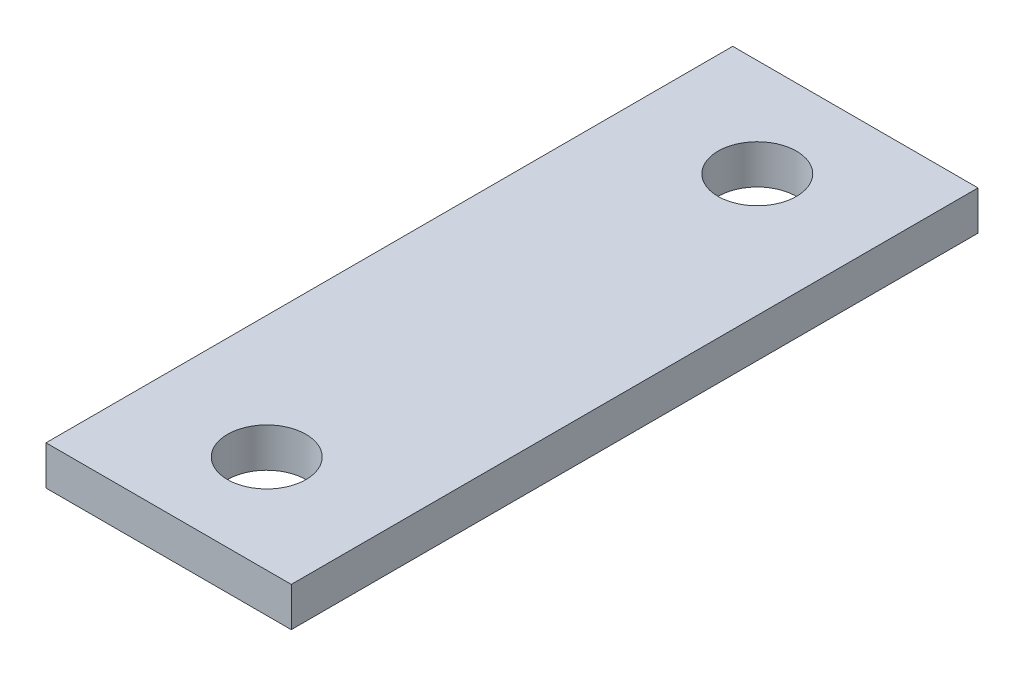
ISO-10303-21;
HEADER;
FILE_DESCRIPTION(('STEP AP214'),'2;1');
FILE_NAME('part.step','',(''),(''),'','','');
FILE_SCHEMA(('AUTOMOTIVE_DESIGN { 1 0 10303 214 1 1 1 1 }'));
ENDSEC;
DATA;
#1=APPLICATION_CONTEXT('core data for automotive mechanical design processes');
#2=APPLICATION_PROTOCOL_DEFINITION('international standard','automotive_design',2000,#1);
#3=PRODUCT_CONTEXT('',#1,'mechanical');
#4=PRODUCT('Part','Part','',(#3));
#5=PRODUCT_RELATED_PRODUCT_CATEGORY('part','',(#4));
#6=PRODUCT_DEFINITION_FORMATION('','',#4);
#7=PRODUCT_DEFINITION_CONTEXT('part definition',#1,'design');
#8=PRODUCT_DEFINITION('design','',#6,#7);
#9=PRODUCT_DEFINITION_SHAPE('','',#8);
#10=(LENGTH_UNIT() NAMED_UNIT(*) SI_UNIT(.MILLI.,.METRE.));
#11=(NAMED_UNIT(*) PLANE_ANGLE_UNIT() SI_UNIT($,.RADIAN.));
#12=(NAMED_UNIT(*) SI_UNIT($,.STERADIAN.) SOLID_ANGLE_UNIT());
#13=UNCERTAINTY_MEASURE_WITH_UNIT(LENGTH_MEASURE(1.E-05),#10,'distance_accuracy_value','');
#14=(GEOMETRIC_REPRESENTATION_CONTEXT(3) GLOBAL_UNCERTAINTY_ASSIGNED_CONTEXT((#13)) GLOBAL_UNIT_ASSIGNED_CONTEXT((#10,
#11,#12)) REPRESENTATION_CONTEXT('',''));
#15=CARTESIAN_POINT('',(0.,0.,0.));
#16=DIRECTION('',(0.,0.,1.));
#17=DIRECTION('',(1.,0.,0.));
#18=AXIS2_PLACEMENT_3D('',#15,#16,#17);
#19=CARTESIAN_POINT('',(0.,4.,0.));
#20=DIRECTION('',(1.,0.,0.));
#21=DIRECTION('',(0.,0.,-1.));
#22=AXIS2_PLACEMENT_3D('',#19,#20,#21);
#23=PLANE('',#22);
#24=DIRECTION('',(0.,0.,1.));
#25=VECTOR('',#24,1.);
#26=CARTESIAN_POINT('',(0.,0.,0.));
#27=LINE('',#26,#25);
#28=CARTESIAN_POINT('',(0.,0.,-70.));
#29=VERTEX_POINT('',#28);
#30=CARTESIAN_POINT('',(0.,0.,0.));
#31=VERTEX_POINT('',#30);
#32=EDGE_CURVE('E96',#29,#31,#27,.T.);
#33=ORIENTED_EDGE('',*,*,#32,.T.);
#34=DIRECTION('',(0.,-1.,0.));
#35=VECTOR('',#34,1.);
#36=CARTESIAN_POINT('',(0.,4.,0.));
#37=LINE('',#36,#35);
#38=CARTESIAN_POINT('',(0.,4.,0.));
#39=VERTEX_POINT('',#38);
#40=EDGE_CURVE('E11',#39,#31,#37,.T.);
#41=ORIENTED_EDGE('',*,*,#40,.F.);
#42=DIRECTION('',(0.,0.,1.));
#43=VECTOR('',#42,1.);
#44=CARTESIAN_POINT('',(0.,4.,0.));
#45=LINE('',#44,#43);
#46=CARTESIAN_POINT('',(0.,4.,-70.));
#47=VERTEX_POINT('',#46);
#48=EDGE_CURVE('E84',#47,#39,#45,.T.);
#49=ORIENTED_EDGE('',*,*,#48,.F.);
#50=DIRECTION('',(0.,-1.,0.));
#51=VECTOR('',#50,1.);
#52=CARTESIAN_POINT('',(0.,4.,-70.));
#53=LINE('',#52,#51);
#54=EDGE_CURVE('E92',#47,#29,#53,.T.);
#55=ORIENTED_EDGE('',*,*,#54,.T.);
#56=EDGE_LOOP('',(#33,#41,#49,#55));
#57=FACE_BOUND('',#56,.T.);
#58=ADVANCED_FACE('F33',(#57),#23,.F.);
#59=CARTESIAN_POINT('',(0.,4.,0.));
#60=DIRECTION('',(0.,0.,-1.));
#61=DIRECTION('',(-1.,0.,0.));
#62=AXIS2_PLACEMENT_3D('',#59,#60,#61);
#63=PLANE('',#62);
#64=DIRECTION('',(1.,0.,0.));
#65=VECTOR('',#64,1.);
#66=CARTESIAN_POINT('',(0.,0.,0.));
#67=LINE('',#66,#65);
#68=CARTESIAN_POINT('',(25.,0.,0.));
#69=VERTEX_POINT('',#68);
#70=EDGE_CURVE('E88',#31,#69,#67,.T.);
#71=ORIENTED_EDGE('',*,*,#70,.T.);
#72=DIRECTION('',(0.,-1.,0.));
#73=VECTOR('',#72,1.);
#74=CARTESIAN_POINT('',(25.,4.,0.));
#75=LINE('',#74,#73);
#76=CARTESIAN_POINT('',(25.,4.,0.));
#77=VERTEX_POINT('',#76);
#78=EDGE_CURVE('E41',#77,#69,#75,.T.);
#79=ORIENTED_EDGE('',*,*,#78,.F.);
#80=DIRECTION('',(1.,0.,0.));
#81=VECTOR('',#80,1.);
#82=CARTESIAN_POINT('',(0.,4.,0.));
#83=LINE('',#82,#81);
#84=EDGE_CURVE('E79',#39,#77,#83,.T.);
#85=ORIENTED_EDGE('',*,*,#84,.F.);
#86=ORIENTED_EDGE('',*,*,#40,.T.);
#87=EDGE_LOOP('',(#71,#79,#85,#86));
#88=FACE_BOUND('',#87,.T.);
#89=ADVANCED_FACE('F87',(#88),#63,.F.);
#90=CARTESIAN_POINT('',(25.,4.,0.));
#91=DIRECTION('',(-1.,0.,0.));
#92=DIRECTION('',(0.,0.,1.));
#93=AXIS2_PLACEMENT_3D('',#90,#91,#92);
#94=PLANE('',#93);
#95=DIRECTION('',(0.,0.,-1.));
#96=VECTOR('',#95,1.);
#97=CARTESIAN_POINT('',(25.,0.,0.));
#98=LINE('',#97,#96);
#99=CARTESIAN_POINT('',(25.,0.,-70.));
#100=VERTEX_POINT('',#99);
#101=EDGE_CURVE('E66',#69,#100,#98,.T.);
#102=ORIENTED_EDGE('',*,*,#101,.T.);
#103=DIRECTION('',(0.,-1.,0.));
#104=VECTOR('',#103,1.);
#105=CARTESIAN_POINT('',(25.,4.,-70.));
#106=LINE('',#105,#104);
#107=CARTESIAN_POINT('',(25.,4.,-70.));
#108=VERTEX_POINT('',#107);
#109=EDGE_CURVE('E89',#108,#100,#106,.T.);
#110=ORIENTED_EDGE('',*,*,#109,.F.);
#111=DIRECTION('',(0.,0.,-1.));
#112=VECTOR('',#111,1.);
#113=CARTESIAN_POINT('',(25.,4.,0.));
#114=LINE('',#113,#112);
#115=EDGE_CURVE('E82',#77,#108,#114,.T.);
#116=ORIENTED_EDGE('',*,*,#115,.F.);
#117=ORIENTED_EDGE('',*,*,#78,.T.);
#118=EDGE_LOOP('',(#102,#110,#116,#117));
#119=FACE_BOUND('',#118,.T.);
#120=ADVANCED_FACE('F90',(#119),#94,.F.);
#121=CARTESIAN_POINT('',(0.,4.,-70.));
#122=DIRECTION('',(0.,0.,1.));
#123=DIRECTION('',(1.,0.,0.));
#124=AXIS2_PLACEMENT_3D('',#121,#122,#123);
#125=PLANE('',#124);
#126=DIRECTION('',(-1.,0.,0.));
#127=VECTOR('',#126,1.);
#128=CARTESIAN_POINT('',(0.,0.,-70.));
#129=LINE('',#128,#127);
#130=EDGE_CURVE('E72',#100,#29,#129,.T.);
#131=ORIENTED_EDGE('',*,*,#130,.T.);
#132=ORIENTED_EDGE('',*,*,#54,.F.);
#133=DIRECTION('',(-1.,0.,0.));
#134=VECTOR('',#133,1.);
#135=CARTESIAN_POINT('',(0.,4.,-70.));
#136=LINE('',#135,#134);
#137=EDGE_CURVE('E49',#108,#47,#136,.T.);
#138=ORIENTED_EDGE('',*,*,#137,.F.);
#139=ORIENTED_EDGE('',*,*,#109,.T.);
#140=EDGE_LOOP('',(#131,#132,#138,#139));
#141=FACE_BOUND('',#140,.T.);
#142=ADVANCED_FACE('F104',(#141),#125,.F.);
#143=CARTESIAN_POINT('',(0.,4.,0.));
#144=DIRECTION('',(0.,-1.,0.));
#145=DIRECTION('',(0.,0.,-1.));
#146=AXIS2_PLACEMENT_3D('',#143,#144,#145);
#147=PLANE('',#146);
#148=CARTESIAN_POINT('',(12.5,4.,-60.));
#149=DIRECTION('',(0.,1.,0.));
#150=DIRECTION('',(0.,0.,1.));
#151=AXIS2_PLACEMENT_3D('',#148,#149,#150);
#152=CIRCLE('',#151,4.);
#153=CARTESIAN_POINT('',(12.5,4.,-56.));
#154=VERTEX_POINT('',#153);
#155=EDGE_CURVE('E116',#154,#154,#152,.T.);
#156=ORIENTED_EDGE('',*,*,#155,.F.);
#157=EDGE_LOOP('',(#156));
#158=FACE_BOUND('',#157,.T.);
#159=CARTESIAN_POINT('',(12.5,4.,-10.));
#160=DIRECTION('',(0.,1.,0.));
#161=DIRECTION('',(0.,0.,1.));
#162=AXIS2_PLACEMENT_3D('',#159,#160,#161);
#163=CIRCLE('',#162,3.99999999999999);
#164=CARTESIAN_POINT('',(12.5,4.,-6.00000000000001));
#165=VERTEX_POINT('',#164);
#166=EDGE_CURVE('E110',#165,#165,#163,.T.);
#167=ORIENTED_EDGE('',*,*,#166,.F.);
#168=EDGE_LOOP('',(#167));
#169=FACE_BOUND('',#168,.T.);
#170=ORIENTED_EDGE('',*,*,#48,.T.);
#171=ORIENTED_EDGE('',*,*,#84,.T.);
#172=ORIENTED_EDGE('',*,*,#115,.T.);
#173=ORIENTED_EDGE('',*,*,#137,.T.);
#174=EDGE_LOOP('',(#170,#171,#172,#173));
#175=FACE_BOUND('',#174,.T.);
#176=ADVANCED_FACE('F80',(#158,#169,#175),#147,.F.);
#177=CARTESIAN_POINT('',(0.,0.,0.));
#178=DIRECTION('',(0.,-1.,0.));
#179=DIRECTION('',(0.,0.,-1.));
#180=AXIS2_PLACEMENT_3D('',#177,#178,#179);
#181=PLANE('',#180);
#182=CARTESIAN_POINT('',(12.5,0.,-60.));
#183=DIRECTION('',(0.,1.,0.));
#184=DIRECTION('',(0.,0.,1.));
#185=AXIS2_PLACEMENT_3D('',#182,#183,#184);
#186=CIRCLE('',#185,4.);
#187=CARTESIAN_POINT('',(12.5,0.,-56.));
#188=VERTEX_POINT('',#187);
#189=EDGE_CURVE('E99',#188,#188,#186,.T.);
#190=ORIENTED_EDGE('',*,*,#189,.T.);
#191=EDGE_LOOP('',(#190));
#192=FACE_BOUND('',#191,.T.);
#193=CARTESIAN_POINT('',(12.5,0.,-10.));
#194=DIRECTION('',(0.,1.,0.));
#195=DIRECTION('',(0.,0.,1.));
#196=AXIS2_PLACEMENT_3D('',#193,#194,#195);
#197=CIRCLE('',#196,3.99999999999999);
#198=CARTESIAN_POINT('',(12.5,0.,-6.00000000000001));
#199=VERTEX_POINT('',#198);
#200=EDGE_CURVE('E113',#199,#199,#197,.T.);
#201=ORIENTED_EDGE('',*,*,#200,.T.);
#202=EDGE_LOOP('',(#201));
#203=FACE_BOUND('',#202,.T.);
#204=ORIENTED_EDGE('',*,*,#32,.F.);
#205=ORIENTED_EDGE('',*,*,#130,.F.);
#206=ORIENTED_EDGE('',*,*,#101,.F.);
#207=ORIENTED_EDGE('',*,*,#70,.F.);
#208=EDGE_LOOP('',(#204,#205,#206,#207));
#209=FACE_BOUND('',#208,.T.);
#210=ADVANCED_FACE('F107',(#192,#203,#209),#181,.T.);
#211=CARTESIAN_POINT('',(12.5,0.,-10.));
#212=DIRECTION('',(0.,1.,0.));
#213=DIRECTION('',(0.,0.,1.));
#214=AXIS2_PLACEMENT_3D('',#211,#212,#213);
#215=CYLINDRICAL_SURFACE('',#214,3.99999999999999);
#216=ORIENTED_EDGE('',*,*,#200,.F.);
#217=EDGE_LOOP('',(#216));
#218=FACE_BOUND('',#217,.T.);
#219=ORIENTED_EDGE('',*,*,#166,.T.);
#220=EDGE_LOOP('',(#219));
#221=FACE_BOUND('',#220,.T.);
#222=ADVANCED_FACE('F127',(#218,#221),#215,.F.);
#223=CARTESIAN_POINT('',(12.5,0.,-60.));
#224=DIRECTION('',(0.,1.,0.));
#225=DIRECTION('',(0.,0.,1.));
#226=AXIS2_PLACEMENT_3D('',#223,#224,#225);
#227=CYLINDRICAL_SURFACE('',#226,4.);
#228=ORIENTED_EDGE('',*,*,#189,.F.);
#229=EDGE_LOOP('',(#228));
#230=FACE_BOUND('',#229,.T.);
#231=ORIENTED_EDGE('',*,*,#155,.T.);
#232=EDGE_LOOP('',(#231));
#233=FACE_BOUND('',#232,.T.);
#234=ADVANCED_FACE('F124',(#230,#233),#227,.F.);
#235=CLOSED_SHELL('',(#58,#89,#120,#142,#176,#210,#222,#234));
#236=MANIFOLD_SOLID_BREP('B2',#235);
#237=ADVANCED_BREP_SHAPE_REPRESENTATION('',(#18,#236),#14);
#238=SHAPE_DEFINITION_REPRESENTATION(#9,#237);
ENDSEC;
END-ISO-10303-21;
